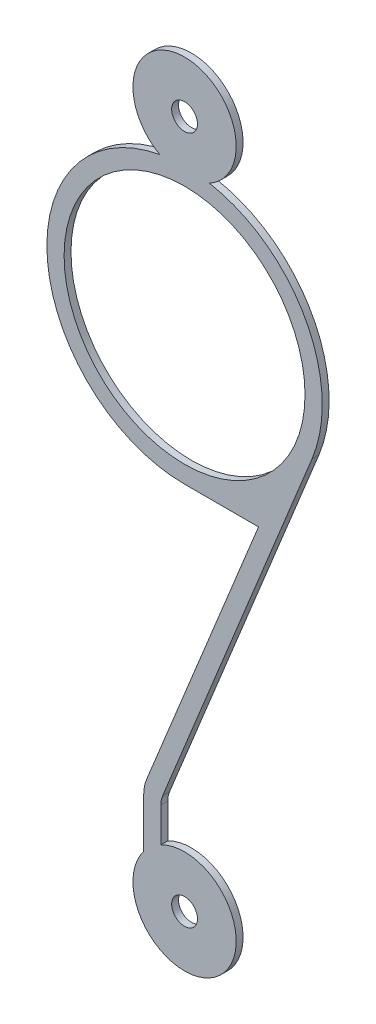
ISO-10303-21;
HEADER;
FILE_DESCRIPTION(('STEP AP214'),'2;1');
FILE_NAME('part.step','',(''),(''),'','','');
FILE_SCHEMA(('AUTOMOTIVE_DESIGN { 1 0 10303 214 1 1 1 1 }'));
ENDSEC;
DATA;
#1=APPLICATION_CONTEXT('core data for automotive mechanical design processes');
#2=APPLICATION_PROTOCOL_DEFINITION('international standard','automotive_design',2000,#1);
#3=PRODUCT_CONTEXT('',#1,'mechanical');
#4=PRODUCT('Part','Part','',(#3));
#5=PRODUCT_RELATED_PRODUCT_CATEGORY('part','',(#4));
#6=PRODUCT_DEFINITION_FORMATION('','',#4);
#7=PRODUCT_DEFINITION_CONTEXT('part definition',#1,'design');
#8=PRODUCT_DEFINITION('design','',#6,#7);
#9=PRODUCT_DEFINITION_SHAPE('','',#8);
#10=(LENGTH_UNIT() NAMED_UNIT(*) SI_UNIT(.MILLI.,.METRE.));
#11=(NAMED_UNIT(*) PLANE_ANGLE_UNIT() SI_UNIT($,.RADIAN.));
#12=(NAMED_UNIT(*) SI_UNIT($,.STERADIAN.) SOLID_ANGLE_UNIT());
#13=UNCERTAINTY_MEASURE_WITH_UNIT(LENGTH_MEASURE(1.E-05),#10,'distance_accuracy_value','');
#14=(GEOMETRIC_REPRESENTATION_CONTEXT(3) GLOBAL_UNCERTAINTY_ASSIGNED_CONTEXT((#13)) GLOBAL_UNIT_ASSIGNED_CONTEXT((#10,
#11,#12)) REPRESENTATION_CONTEXT('',''));
#15=CARTESIAN_POINT('',(0.,0.,0.));
#16=DIRECTION('',(0.,0.,1.));
#17=DIRECTION('',(1.,0.,0.));
#18=AXIS2_PLACEMENT_3D('',#15,#16,#17);
#19=CARTESIAN_POINT('',(0.,4.75,0.1));
#20=DIRECTION('',(0.,0.,1.));
#21=DIRECTION('',(1.,0.,0.));
#22=AXIS2_PLACEMENT_3D('',#19,#20,#21);
#23=PLANE('',#22);
#24=CARTESIAN_POINT('',(0.,10.,0.1));
#25=DIRECTION('',(0.,0.,1.));
#26=DIRECTION('',(1.,0.,0.));
#27=AXIS2_PLACEMENT_3D('',#24,#25,#26);
#28=CIRCLE('',#27,0.375000000000139);
#29=CARTESIAN_POINT('',(0.375000000000209,10.,0.1));
#30=VERTEX_POINT('',#29);
#31=EDGE_CURVE('E274',#30,#30,#28,.T.);
#32=ORIENTED_EDGE('',*,*,#31,.F.);
#33=EDGE_LOOP('',(#32));
#34=FACE_BOUND('',#33,.T.);
#35=CARTESIAN_POINT('',(0.,4.75,0.1));
#36=DIRECTION('',(0.,0.,1.));
#37=DIRECTION('',(1.,0.,0.));
#38=AXIS2_PLACEMENT_3D('',#35,#36,#37);
#39=CIRCLE('',#38,4.);
#40=CARTESIAN_POINT('',(-0.720779017654021,8.68452380952387,0.1));
#41=VERTEX_POINT('',#40);
#42=CARTESIAN_POINT('',(0.,0.750000000000003,0.1));
#43=VERTEX_POINT('',#42);
#44=EDGE_CURVE('E171',#41,#43,#39,.T.);
#45=ORIENTED_EDGE('',*,*,#44,.T.);
#46=DIRECTION('',(1.,0.,0.));
#47=VECTOR('',#46,1.);
#48=CARTESIAN_POINT('',(0.,0.750000000000003,0.1));
#49=LINE('',#48,#47);
#50=CARTESIAN_POINT('',(2.14896592734824,0.75,0.1));
#51=VERTEX_POINT('',#50);
#52=EDGE_CURVE('E104',#43,#51,#49,.T.);
#53=ORIENTED_EDGE('',*,*,#52,.T.);
#54=DIRECTION('',(-0.37751182971274,-0.926004761557379,0.));
#55=VECTOR('',#54,1.);
#56=CARTESIAN_POINT('',(-1.09963065434932,-7.2185341392348,0.1));
#57=LINE('',#56,#55);
#58=CARTESIAN_POINT('',(-1.09963065434933,-7.2185341392348,0.1));
#59=VERTEX_POINT('',#58);
#60=EDGE_CURVE('E195',#51,#59,#57,.T.);
#61=ORIENTED_EDGE('',*,*,#60,.T.);
#62=CARTESIAN_POINT('',(0.,-7.66682943701865,0.1));
#63=DIRECTION('',(0.,0.,1.));
#64=DIRECTION('',(-1.,0.,0.));
#65=AXIS2_PLACEMENT_3D('',#62,#63,#64);
#66=CIRCLE('',#65,1.18749999999999);
#67=CARTESIAN_POINT('',(-1.18749999999994,-7.66682943701866,0.1));
#68=VERTEX_POINT('',#67);
#69=EDGE_CURVE('E214',#59,#68,#66,.T.);
#70=ORIENTED_EDGE('',*,*,#69,.T.);
#71=DIRECTION('',(0.,-1.,0.));
#72=VECTOR('',#71,1.);
#73=CARTESIAN_POINT('',(-1.18749999999994,-7.66682943701866,0.1));
#74=LINE('',#73,#72);
#75=CARTESIAN_POINT('',(-1.18749999999994,-9.08357010633656,0.1));
#76=VERTEX_POINT('',#75);
#77=EDGE_CURVE('E211',#68,#76,#74,.T.);
#78=ORIENTED_EDGE('',*,*,#77,.T.);
#79=CARTESIAN_POINT('',(0.,-10.,0.1));
#80=DIRECTION('',(0.,0.,1.));
#81=DIRECTION('',(1.,0.,0.));
#82=AXIS2_PLACEMENT_3D('',#79,#80,#81);
#83=CIRCLE('',#82,1.5);
#84=CARTESIAN_POINT('',(-0.68749999999994,-8.66682943701866,0.1));
#85=VERTEX_POINT('',#84);
#86=EDGE_CURVE('E213',#76,#85,#83,.T.);
#87=ORIENTED_EDGE('',*,*,#86,.T.);
#88=DIRECTION('',(0.,1.,0.));
#89=VECTOR('',#88,1.);
#90=CARTESIAN_POINT('',(-0.687499999999944,-7.66682943701866,0.1));
#91=LINE('',#90,#89);
#92=CARTESIAN_POINT('',(-0.687499999999942,-7.66682943701866,0.1));
#93=VERTEX_POINT('',#92);
#94=EDGE_CURVE('E216',#85,#93,#91,.T.);
#95=ORIENTED_EDGE('',*,*,#94,.T.);
#96=CARTESIAN_POINT('',(0.,-7.66682943701865,0.1));
#97=DIRECTION('',(0.,0.,-1.));
#98=DIRECTION('',(-1.,0.,0.));
#99=AXIS2_PLACEMENT_3D('',#96,#97,#98);
#100=CIRCLE('',#99,0.687499999999995);
#101=CARTESIAN_POINT('',(-0.636628273570647,-7.40729005409117,0.1));
#102=VERTEX_POINT('',#101);
#103=EDGE_CURVE('E132',#93,#102,#100,.T.);
#104=ORIENTED_EDGE('',*,*,#103,.T.);
#105=DIRECTION('',(0.377511829712741,0.926004761557379,0.));
#106=VECTOR('',#105,1.);
#107=CARTESIAN_POINT('',(-0.636628273570647,-7.40729005409117,0.1));
#108=LINE('',#107,#106);
#109=CARTESIAN_POINT('',(3.7040190462295,3.23995268114904,0.1));
#110=VERTEX_POINT('',#109);
#111=EDGE_CURVE('E126',#102,#110,#108,.T.);
#112=ORIENTED_EDGE('',*,*,#111,.T.);
#113=CARTESIAN_POINT('',(0.,4.75,0.1));
#114=DIRECTION('',(0.,0.,1.));
#115=DIRECTION('',(1.,0.,0.));
#116=AXIS2_PLACEMENT_3D('',#113,#114,#115);
#117=CIRCLE('',#116,4.00000000000001);
#118=CARTESIAN_POINT('',(0.720779017653956,8.68452380952375,0.1));
#119=VERTEX_POINT('',#118);
#120=EDGE_CURVE('E130',#110,#119,#117,.T.);
#121=ORIENTED_EDGE('',*,*,#120,.T.);
#122=CARTESIAN_POINT('',(0.,10.,0.1));
#123=DIRECTION('',(0.,0.,1.));
#124=DIRECTION('',(1.,0.,0.));
#125=AXIS2_PLACEMENT_3D('',#122,#123,#124);
#126=CIRCLE('',#125,1.5);
#127=EDGE_CURVE('E52',#119,#41,#126,.T.);
#128=ORIENTED_EDGE('',*,*,#127,.T.);
#129=EDGE_LOOP('',(#45,#53,#61,#70,#78,#87,#95,#104,#112,#121,#128));
#130=FACE_BOUND('',#129,.T.);
#131=CARTESIAN_POINT('',(0.,-10.,0.1));
#132=DIRECTION('',(0.,0.,1.));
#133=DIRECTION('',(1.,0.,0.));
#134=AXIS2_PLACEMENT_3D('',#131,#132,#133);
#135=CIRCLE('',#134,0.375);
#136=CARTESIAN_POINT('',(0.37500000000007,-10.,0.1));
#137=VERTEX_POINT('',#136);
#138=EDGE_CURVE('E154',#137,#137,#135,.T.);
#139=ORIENTED_EDGE('',*,*,#138,.F.);
#140=EDGE_LOOP('',(#139));
#141=FACE_BOUND('',#140,.T.);
#142=CARTESIAN_POINT('',(0.,4.75,0.1));
#143=DIRECTION('',(0.,0.,1.));
#144=DIRECTION('',(1.,0.,0.));
#145=AXIS2_PLACEMENT_3D('',#142,#143,#144);
#146=CIRCLE('',#145,3.5);
#147=CARTESIAN_POINT('',(3.49999999999996,4.75,0.1));
#148=VERTEX_POINT('',#147);
#149=EDGE_CURVE('E265',#148,#148,#146,.T.);
#150=ORIENTED_EDGE('',*,*,#149,.F.);
#151=EDGE_LOOP('',(#150));
#152=FACE_BOUND('',#151,.T.);
#153=ADVANCED_FACE('F35',(#34,#130,#141,#152),#23,.T.);
#154=CARTESIAN_POINT('',(0.,4.75,-0.1));
#155=DIRECTION('',(0.,0.,1.));
#156=DIRECTION('',(1.,0.,0.));
#157=AXIS2_PLACEMENT_3D('',#154,#155,#156);
#158=PLANE('',#157);
#159=CARTESIAN_POINT('',(0.,4.75,-0.1));
#160=DIRECTION('',(0.,0.,1.));
#161=DIRECTION('',(1.,0.,0.));
#162=AXIS2_PLACEMENT_3D('',#159,#160,#161);
#163=CIRCLE('',#162,4.);
#164=CARTESIAN_POINT('',(-0.720779017654021,8.68452380952387,-0.1));
#165=VERTEX_POINT('',#164);
#166=CARTESIAN_POINT('',(0.,0.750000000000003,-0.1));
#167=VERTEX_POINT('',#166);
#168=EDGE_CURVE('E150',#165,#167,#163,.T.);
#169=ORIENTED_EDGE('',*,*,#168,.F.);
#170=CARTESIAN_POINT('',(0.,10.,-0.1));
#171=DIRECTION('',(0.,0.,1.));
#172=DIRECTION('',(1.,0.,0.));
#173=AXIS2_PLACEMENT_3D('',#170,#171,#172);
#174=CIRCLE('',#173,1.5);
#175=CARTESIAN_POINT('',(0.720779017653956,8.68452380952375,-0.1));
#176=VERTEX_POINT('',#175);
#177=EDGE_CURVE('E96',#176,#165,#174,.T.);
#178=ORIENTED_EDGE('',*,*,#177,.F.);
#179=CARTESIAN_POINT('',(0.,4.75,-0.1));
#180=DIRECTION('',(0.,0.,1.));
#181=DIRECTION('',(1.,0.,0.));
#182=AXIS2_PLACEMENT_3D('',#179,#180,#181);
#183=CIRCLE('',#182,4.00000000000001);
#184=CARTESIAN_POINT('',(3.7040190462295,3.23995268114904,-0.1));
#185=VERTEX_POINT('',#184);
#186=EDGE_CURVE('E90',#185,#176,#183,.T.);
#187=ORIENTED_EDGE('',*,*,#186,.F.);
#188=DIRECTION('',(0.377511829712741,0.926004761557379,0.));
#189=VECTOR('',#188,1.);
#190=CARTESIAN_POINT('',(-0.636628273570647,-7.40729005409117,-0.1));
#191=LINE('',#190,#189);
#192=CARTESIAN_POINT('',(-0.636628273570647,-7.40729005409117,-0.1));
#193=VERTEX_POINT('',#192);
#194=EDGE_CURVE('E140',#193,#185,#191,.T.);
#195=ORIENTED_EDGE('',*,*,#194,.F.);
#196=CARTESIAN_POINT('',(0.,-7.66682943701865,-0.1));
#197=DIRECTION('',(0.,0.,-1.));
#198=DIRECTION('',(-1.,0.,0.));
#199=AXIS2_PLACEMENT_3D('',#196,#197,#198);
#200=CIRCLE('',#199,0.687499999999995);
#201=CARTESIAN_POINT('',(-0.687499999999942,-7.66682943701866,-0.1));
#202=VERTEX_POINT('',#201);
#203=EDGE_CURVE('E166',#202,#193,#200,.T.);
#204=ORIENTED_EDGE('',*,*,#203,.F.);
#205=DIRECTION('',(0.,1.,0.));
#206=VECTOR('',#205,1.);
#207=CARTESIAN_POINT('',(-0.687499999999944,-7.66682943701866,-0.1));
#208=LINE('',#207,#206);
#209=CARTESIAN_POINT('',(-0.68749999999994,-8.66682943701866,-0.1));
#210=VERTEX_POINT('',#209);
#211=EDGE_CURVE('E164',#210,#202,#208,.T.);
#212=ORIENTED_EDGE('',*,*,#211,.F.);
#213=CARTESIAN_POINT('',(0.,-10.,-0.1));
#214=DIRECTION('',(0.,0.,1.));
#215=DIRECTION('',(1.,0.,0.));
#216=AXIS2_PLACEMENT_3D('',#213,#214,#215);
#217=CIRCLE('',#216,1.5);
#218=CARTESIAN_POINT('',(-1.18749999999994,-9.08357010633656,-0.1));
#219=VERTEX_POINT('',#218);
#220=EDGE_CURVE('E162',#219,#210,#217,.T.);
#221=ORIENTED_EDGE('',*,*,#220,.F.);
#222=DIRECTION('',(0.,-1.,0.));
#223=VECTOR('',#222,1.);
#224=CARTESIAN_POINT('',(-1.18749999999994,-7.66682943701866,-0.1));
#225=LINE('',#224,#223);
#226=CARTESIAN_POINT('',(-1.18749999999994,-7.66682943701866,-0.1));
#227=VERTEX_POINT('',#226);
#228=EDGE_CURVE('E160',#227,#219,#225,.T.);
#229=ORIENTED_EDGE('',*,*,#228,.F.);
#230=CARTESIAN_POINT('',(0.,-7.66682943701865,-0.1));
#231=DIRECTION('',(0.,0.,1.));
#232=DIRECTION('',(-1.,0.,0.));
#233=AXIS2_PLACEMENT_3D('',#230,#231,#232);
#234=CIRCLE('',#233,1.18749999999999);
#235=CARTESIAN_POINT('',(-1.09963065434933,-7.2185341392348,-0.1));
#236=VERTEX_POINT('',#235);
#237=EDGE_CURVE('E158',#236,#227,#234,.T.);
#238=ORIENTED_EDGE('',*,*,#237,.F.);
#239=DIRECTION('',(-0.37751182971274,-0.926004761557379,0.));
#240=VECTOR('',#239,1.);
#241=CARTESIAN_POINT('',(-1.09963065434932,-7.2185341392348,-0.1));
#242=LINE('',#241,#240);
#243=CARTESIAN_POINT('',(2.14896592734824,0.75,-0.1));
#244=VERTEX_POINT('',#243);
#245=EDGE_CURVE('E156',#244,#236,#242,.T.);
#246=ORIENTED_EDGE('',*,*,#245,.F.);
#247=DIRECTION('',(1.,0.,0.));
#248=VECTOR('',#247,1.);
#249=CARTESIAN_POINT('',(0.,0.750000000000003,-0.1));
#250=LINE('',#249,#248);
#251=EDGE_CURVE('E153',#167,#244,#250,.T.);
#252=ORIENTED_EDGE('',*,*,#251,.F.);
#253=EDGE_LOOP('',(#169,#178,#187,#195,#204,#212,#221,#229,#238,#246,#252));
#254=FACE_BOUND('',#253,.T.);
#255=CARTESIAN_POINT('',(0.,-10.,-0.1));
#256=DIRECTION('',(0.,0.,1.));
#257=DIRECTION('',(1.,0.,0.));
#258=AXIS2_PLACEMENT_3D('',#255,#256,#257);
#259=CIRCLE('',#258,0.375);
#260=CARTESIAN_POINT('',(0.37500000000007,-10.,-0.1));
#261=VERTEX_POINT('',#260);
#262=EDGE_CURVE('E277',#261,#261,#259,.T.);
#263=ORIENTED_EDGE('',*,*,#262,.T.);
#264=EDGE_LOOP('',(#263));
#265=FACE_BOUND('',#264,.T.);
#266=CARTESIAN_POINT('',(0.,10.,-0.1));
#267=DIRECTION('',(0.,0.,1.));
#268=DIRECTION('',(1.,0.,0.));
#269=AXIS2_PLACEMENT_3D('',#266,#267,#268);
#270=CIRCLE('',#269,0.375000000000139);
#271=CARTESIAN_POINT('',(0.375000000000209,10.,-0.1));
#272=VERTEX_POINT('',#271);
#273=EDGE_CURVE('E271',#272,#272,#270,.T.);
#274=ORIENTED_EDGE('',*,*,#273,.T.);
#275=EDGE_LOOP('',(#274));
#276=FACE_BOUND('',#275,.T.);
#277=CARTESIAN_POINT('',(0.,4.75,-0.1));
#278=DIRECTION('',(0.,0.,1.));
#279=DIRECTION('',(1.,0.,0.));
#280=AXIS2_PLACEMENT_3D('',#277,#278,#279);
#281=CIRCLE('',#280,3.5);
#282=CARTESIAN_POINT('',(3.49999999999996,4.75,-0.1));
#283=VERTEX_POINT('',#282);
#284=EDGE_CURVE('E268',#283,#283,#281,.T.);
#285=ORIENTED_EDGE('',*,*,#284,.T.);
#286=EDGE_LOOP('',(#285));
#287=FACE_BOUND('',#286,.T.);
#288=ADVANCED_FACE('F199',(#254,#265,#276,#287),#158,.F.);
#289=CARTESIAN_POINT('',(0.,4.75,0.1));
#290=DIRECTION('',(0.,0.,-1.));
#291=DIRECTION('',(-1.,0.,0.));
#292=AXIS2_PLACEMENT_3D('',#289,#290,#291);
#293=CYLINDRICAL_SURFACE('',#292,4.);
#294=ORIENTED_EDGE('',*,*,#168,.T.);
#295=DIRECTION('',(0.,0.,-1.));
#296=VECTOR('',#295,1.);
#297=CARTESIAN_POINT('',(0.,0.750000000000003,0.1));
#298=LINE('',#297,#296);
#299=EDGE_CURVE('E11',#43,#167,#298,.T.);
#300=ORIENTED_EDGE('',*,*,#299,.F.);
#301=ORIENTED_EDGE('',*,*,#44,.F.);
#302=DIRECTION('',(0.,0.,-1.));
#303=VECTOR('',#302,1.);
#304=CARTESIAN_POINT('',(-0.720779017654021,8.68452380952387,0.1));
#305=LINE('',#304,#303);
#306=EDGE_CURVE('E146',#41,#165,#305,.T.);
#307=ORIENTED_EDGE('',*,*,#306,.T.);
#308=EDGE_LOOP('',(#294,#300,#301,#307));
#309=FACE_BOUND('',#308,.T.);
#310=ADVANCED_FACE('F37',(#309),#293,.T.);
#311=CARTESIAN_POINT('',(0.,0.750000000000003,0.1));
#312=DIRECTION('',(0.,1.,0.));
#313=DIRECTION('',(-1.,0.,0.));
#314=AXIS2_PLACEMENT_3D('',#311,#312,#313);
#315=PLANE('',#314);
#316=ORIENTED_EDGE('',*,*,#251,.T.);
#317=DIRECTION('',(0.,0.,-1.));
#318=VECTOR('',#317,1.);
#319=CARTESIAN_POINT('',(2.14896592734824,0.75,0.1));
#320=LINE('',#319,#318);
#321=EDGE_CURVE('E44',#51,#244,#320,.T.);
#322=ORIENTED_EDGE('',*,*,#321,.F.);
#323=ORIENTED_EDGE('',*,*,#52,.F.);
#324=ORIENTED_EDGE('',*,*,#299,.T.);
#325=EDGE_LOOP('',(#316,#322,#323,#324));
#326=FACE_BOUND('',#325,.T.);
#327=ADVANCED_FACE('F369',(#326),#315,.F.);
#328=CARTESIAN_POINT('',(-1.09963065434932,-7.2185341392348,0.1));
#329=DIRECTION('',(0.926004761557379,-0.37751182971274,0.));
#330=DIRECTION('',(0.37751182971274,0.926004761557379,0.));
#331=AXIS2_PLACEMENT_3D('',#328,#329,#330);
#332=PLANE('',#331);
#333=ORIENTED_EDGE('',*,*,#245,.T.);
#334=DIRECTION('',(0.,0.,-1.));
#335=VECTOR('',#334,1.);
#336=CARTESIAN_POINT('',(-1.09963065434933,-7.2185341392348,0.1));
#337=LINE('',#336,#335);
#338=EDGE_CURVE('E187',#59,#236,#337,.T.);
#339=ORIENTED_EDGE('',*,*,#338,.F.);
#340=ORIENTED_EDGE('',*,*,#60,.F.);
#341=ORIENTED_EDGE('',*,*,#321,.T.);
#342=EDGE_LOOP('',(#333,#339,#340,#341));
#343=FACE_BOUND('',#342,.T.);
#344=ADVANCED_FACE('F193',(#343),#332,.F.);
#345=CARTESIAN_POINT('',(0.,-7.66682943701865,0.1));
#346=DIRECTION('',(0.,0.,-1.));
#347=DIRECTION('',(-1.,0.,0.));
#348=AXIS2_PLACEMENT_3D('',#345,#346,#347);
#349=CYLINDRICAL_SURFACE('',#348,1.18749999999999);
#350=ORIENTED_EDGE('',*,*,#237,.T.);
#351=DIRECTION('',(0.,0.,-1.));
#352=VECTOR('',#351,1.);
#353=CARTESIAN_POINT('',(-1.18749999999994,-7.66682943701866,0.1));
#354=LINE('',#353,#352);
#355=EDGE_CURVE('E184',#68,#227,#354,.T.);
#356=ORIENTED_EDGE('',*,*,#355,.F.);
#357=ORIENTED_EDGE('',*,*,#69,.F.);
#358=ORIENTED_EDGE('',*,*,#338,.T.);
#359=EDGE_LOOP('',(#350,#356,#357,#358));
#360=FACE_BOUND('',#359,.T.);
#361=ADVANCED_FACE('F205',(#360),#349,.T.);
#362=CARTESIAN_POINT('',(-1.18749999999994,-7.66682943701866,0.1));
#363=DIRECTION('',(1.,0.,0.));
#364=DIRECTION('',(0.,1.,0.));
#365=AXIS2_PLACEMENT_3D('',#362,#363,#364);
#366=PLANE('',#365);
#367=ORIENTED_EDGE('',*,*,#228,.T.);
#368=DIRECTION('',(0.,0.,-1.));
#369=VECTOR('',#368,1.);
#370=CARTESIAN_POINT('',(-1.18749999999994,-9.08357010633656,0.1));
#371=LINE('',#370,#369);
#372=EDGE_CURVE('E181',#76,#219,#371,.T.);
#373=ORIENTED_EDGE('',*,*,#372,.F.);
#374=ORIENTED_EDGE('',*,*,#77,.F.);
#375=ORIENTED_EDGE('',*,*,#355,.T.);
#376=EDGE_LOOP('',(#367,#373,#374,#375));
#377=FACE_BOUND('',#376,.T.);
#378=ADVANCED_FACE('F209',(#377),#366,.F.);
#379=CARTESIAN_POINT('',(0.,-10.,0.1));
#380=DIRECTION('',(0.,0.,-1.));
#381=DIRECTION('',(-1.,0.,0.));
#382=AXIS2_PLACEMENT_3D('',#379,#380,#381);
#383=CYLINDRICAL_SURFACE('',#382,1.5);
#384=ORIENTED_EDGE('',*,*,#220,.T.);
#385=DIRECTION('',(0.,0.,-1.));
#386=VECTOR('',#385,1.);
#387=CARTESIAN_POINT('',(-0.68749999999994,-8.66682943701866,0.1));
#388=LINE('',#387,#386);
#389=EDGE_CURVE('E178',#85,#210,#388,.T.);
#390=ORIENTED_EDGE('',*,*,#389,.F.);
#391=ORIENTED_EDGE('',*,*,#86,.F.);
#392=ORIENTED_EDGE('',*,*,#372,.T.);
#393=EDGE_LOOP('',(#384,#390,#391,#392));
#394=FACE_BOUND('',#393,.T.);
#395=ADVANCED_FACE('F335',(#394),#383,.T.);
#396=CARTESIAN_POINT('',(-0.687499999999944,-7.66682943701866,0.1));
#397=DIRECTION('',(-1.,0.,0.));
#398=DIRECTION('',(0.,-1.,0.));
#399=AXIS2_PLACEMENT_3D('',#396,#397,#398);
#400=PLANE('',#399);
#401=ORIENTED_EDGE('',*,*,#211,.T.);
#402=DIRECTION('',(0.,0.,-1.));
#403=VECTOR('',#402,1.);
#404=CARTESIAN_POINT('',(-0.687499999999942,-7.66682943701866,0.1));
#405=LINE('',#404,#403);
#406=EDGE_CURVE('E175',#93,#202,#405,.T.);
#407=ORIENTED_EDGE('',*,*,#406,.F.);
#408=ORIENTED_EDGE('',*,*,#94,.F.);
#409=ORIENTED_EDGE('',*,*,#389,.T.);
#410=EDGE_LOOP('',(#401,#407,#408,#409));
#411=FACE_BOUND('',#410,.T.);
#412=ADVANCED_FACE('F225',(#411),#400,.F.);
#413=CARTESIAN_POINT('',(0.,-7.66682943701865,0.1));
#414=DIRECTION('',(0.,0.,-1.));
#415=DIRECTION('',(-1.,0.,0.));
#416=AXIS2_PLACEMENT_3D('',#413,#414,#415);
#417=CYLINDRICAL_SURFACE('',#416,0.687499999999995);
#418=ORIENTED_EDGE('',*,*,#203,.T.);
#419=DIRECTION('',(0.,0.,-1.));
#420=VECTOR('',#419,1.);
#421=CARTESIAN_POINT('',(-0.636628273570647,-7.40729005409117,0.1));
#422=LINE('',#421,#420);
#423=EDGE_CURVE('E141',#102,#193,#422,.T.);
#424=ORIENTED_EDGE('',*,*,#423,.F.);
#425=ORIENTED_EDGE('',*,*,#103,.F.);
#426=ORIENTED_EDGE('',*,*,#406,.T.);
#427=EDGE_LOOP('',(#418,#424,#425,#426));
#428=FACE_BOUND('',#427,.T.);
#429=ADVANCED_FACE('F229',(#428),#417,.F.);
#430=CARTESIAN_POINT('',(-0.636628273570647,-7.40729005409117,0.1));
#431=DIRECTION('',(-0.926004761557379,0.377511829712741,0.));
#432=DIRECTION('',(-0.377511829712741,-0.926004761557379,0.));
#433=AXIS2_PLACEMENT_3D('',#430,#431,#432);
#434=PLANE('',#433);
#435=ORIENTED_EDGE('',*,*,#194,.T.);
#436=DIRECTION('',(0.,0.,-1.));
#437=VECTOR('',#436,1.);
#438=CARTESIAN_POINT('',(3.7040190462295,3.23995268114904,0.1));
#439=LINE('',#438,#437);
#440=EDGE_CURVE('E137',#110,#185,#439,.T.);
#441=ORIENTED_EDGE('',*,*,#440,.F.);
#442=ORIENTED_EDGE('',*,*,#111,.F.);
#443=ORIENTED_EDGE('',*,*,#423,.T.);
#444=EDGE_LOOP('',(#435,#441,#442,#443));
#445=FACE_BOUND('',#444,.T.);
#446=ADVANCED_FACE('F138',(#445),#434,.F.);
#447=CARTESIAN_POINT('',(0.,4.75,0.1));
#448=DIRECTION('',(0.,0.,-1.));
#449=DIRECTION('',(-1.,0.,0.));
#450=AXIS2_PLACEMENT_3D('',#447,#448,#449);
#451=CYLINDRICAL_SURFACE('',#450,4.00000000000001);
#452=ORIENTED_EDGE('',*,*,#186,.T.);
#453=DIRECTION('',(0.,0.,-1.));
#454=VECTOR('',#453,1.);
#455=CARTESIAN_POINT('',(0.720779017653956,8.68452380952375,0.1));
#456=LINE('',#455,#454);
#457=EDGE_CURVE('E142',#119,#176,#456,.T.);
#458=ORIENTED_EDGE('',*,*,#457,.F.);
#459=ORIENTED_EDGE('',*,*,#120,.F.);
#460=ORIENTED_EDGE('',*,*,#440,.T.);
#461=EDGE_LOOP('',(#452,#458,#459,#460));
#462=FACE_BOUND('',#461,.T.);
#463=ADVANCED_FACE('F144',(#462),#451,.T.);
#464=CARTESIAN_POINT('',(0.,10.,0.1));
#465=DIRECTION('',(0.,0.,-1.));
#466=DIRECTION('',(-1.,0.,0.));
#467=AXIS2_PLACEMENT_3D('',#464,#465,#466);
#468=CYLINDRICAL_SURFACE('',#467,1.5);
#469=ORIENTED_EDGE('',*,*,#177,.T.);
#470=ORIENTED_EDGE('',*,*,#306,.F.);
#471=ORIENTED_EDGE('',*,*,#127,.F.);
#472=ORIENTED_EDGE('',*,*,#457,.T.);
#473=EDGE_LOOP('',(#469,#470,#471,#472));
#474=FACE_BOUND('',#473,.T.);
#475=ADVANCED_FACE('F233',(#474),#468,.T.);
#476=CARTESIAN_POINT('',(0.,-10.,0.1));
#477=DIRECTION('',(0.,0.,-1.));
#478=DIRECTION('',(-1.,0.,0.));
#479=AXIS2_PLACEMENT_3D('',#476,#477,#478);
#480=CYLINDRICAL_SURFACE('',#479,0.375);
#481=ORIENTED_EDGE('',*,*,#138,.T.);
#482=EDGE_LOOP('',(#481));
#483=FACE_BOUND('',#482,.T.);
#484=ORIENTED_EDGE('',*,*,#262,.F.);
#485=EDGE_LOOP('',(#484));
#486=FACE_BOUND('',#485,.T.);
#487=ADVANCED_FACE('F235',(#483,#486),#480,.F.);
#488=CARTESIAN_POINT('',(0.,10.,0.1));
#489=DIRECTION('',(0.,0.,-1.));
#490=DIRECTION('',(-1.,0.,0.));
#491=AXIS2_PLACEMENT_3D('',#488,#489,#490);
#492=CYLINDRICAL_SURFACE('',#491,0.375000000000139);
#493=ORIENTED_EDGE('',*,*,#31,.T.);
#494=EDGE_LOOP('',(#493));
#495=FACE_BOUND('',#494,.T.);
#496=ORIENTED_EDGE('',*,*,#273,.F.);
#497=EDGE_LOOP('',(#496));
#498=FACE_BOUND('',#497,.T.);
#499=ADVANCED_FACE('F241',(#495,#498),#492,.F.);
#500=CARTESIAN_POINT('',(0.,4.75,0.1));
#501=DIRECTION('',(0.,0.,-1.));
#502=DIRECTION('',(-1.,0.,0.));
#503=AXIS2_PLACEMENT_3D('',#500,#501,#502);
#504=CYLINDRICAL_SURFACE('',#503,3.5);
#505=ORIENTED_EDGE('',*,*,#149,.T.);
#506=EDGE_LOOP('',(#505));
#507=FACE_BOUND('',#506,.T.);
#508=ORIENTED_EDGE('',*,*,#284,.F.);
#509=EDGE_LOOP('',(#508));
#510=FACE_BOUND('',#509,.T.);
#511=ADVANCED_FACE('F256',(#507,#510),#504,.F.);
#512=CLOSED_SHELL('',(#153,#288,#310,#327,#344,#361,#378,#395,#412,#429,#446,#463,#475,#487,
#499,#511));
#513=MANIFOLD_SOLID_BREP('B2',#512);
#514=ADVANCED_BREP_SHAPE_REPRESENTATION('',(#18,#513),#14);
#515=SHAPE_DEFINITION_REPRESENTATION(#9,#514);
ENDSEC;
END-ISO-10303-21;
